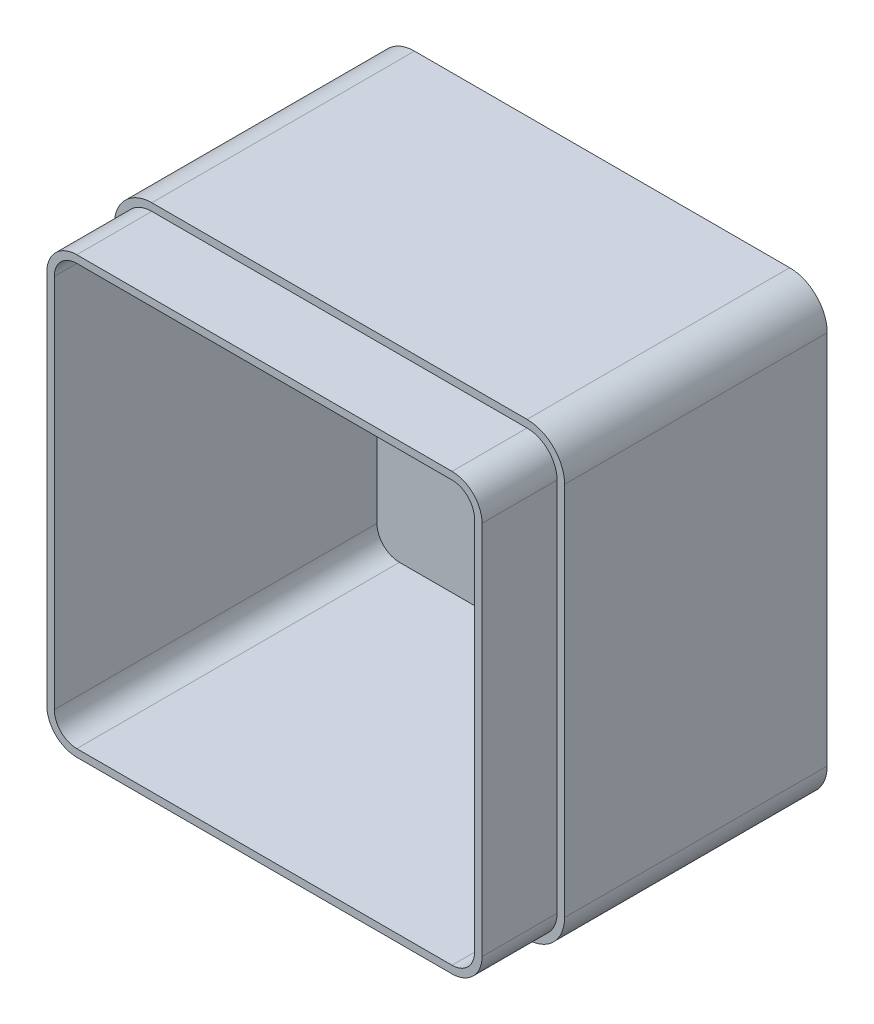
ISO-10303-21;
HEADER;
FILE_DESCRIPTION(('STEP AP214'),'2;1');
FILE_NAME('part.step','',(''),(''),'','','');
FILE_SCHEMA(('AUTOMOTIVE_DESIGN { 1 0 10303 214 1 1 1 1 }'));
ENDSEC;
DATA;
#1=APPLICATION_CONTEXT('core data for automotive mechanical design processes');
#2=APPLICATION_PROTOCOL_DEFINITION('international standard','automotive_design',2000,#1);
#3=PRODUCT_CONTEXT('',#1,'mechanical');
#4=PRODUCT('Part','Part','',(#3));
#5=PRODUCT_RELATED_PRODUCT_CATEGORY('part','',(#4));
#6=PRODUCT_DEFINITION_FORMATION('','',#4);
#7=PRODUCT_DEFINITION_CONTEXT('part definition',#1,'design');
#8=PRODUCT_DEFINITION('design','',#6,#7);
#9=PRODUCT_DEFINITION_SHAPE('','',#8);
#10=(LENGTH_UNIT() NAMED_UNIT(*) SI_UNIT(.MILLI.,.METRE.));
#11=(NAMED_UNIT(*) PLANE_ANGLE_UNIT() SI_UNIT($,.RADIAN.));
#12=(NAMED_UNIT(*) SI_UNIT($,.STERADIAN.) SOLID_ANGLE_UNIT());
#13=UNCERTAINTY_MEASURE_WITH_UNIT(LENGTH_MEASURE(1.E-05),#10,'distance_accuracy_value','');
#14=(GEOMETRIC_REPRESENTATION_CONTEXT(3) GLOBAL_UNCERTAINTY_ASSIGNED_CONTEXT((#13)) GLOBAL_UNIT_ASSIGNED_CONTEXT((#10,
#11,#12)) REPRESENTATION_CONTEXT('',''));
#15=CARTESIAN_POINT('',(0.,0.,0.));
#16=DIRECTION('',(0.,0.,1.));
#17=DIRECTION('',(1.,0.,0.));
#18=AXIS2_PLACEMENT_3D('',#15,#16,#17);
#19=CARTESIAN_POINT('',(0.,0.,90.));
#20=DIRECTION('',(0.,0.,-1.));
#21=DIRECTION('',(-1.,0.,0.));
#22=AXIS2_PLACEMENT_3D('',#19,#20,#21);
#23=PLANE('',#22);
#24=DIRECTION('',(0.,-1.,0.));
#25=VECTOR('',#24,1.);
#26=CARTESIAN_POINT('',(4.,0.,90.));
#27=LINE('',#26,#25);
#28=CARTESIAN_POINT('',(3.99999999999997,110.,90.));
#29=VERTEX_POINT('',#28);
#30=CARTESIAN_POINT('',(4.,10.,90.));
#31=VERTEX_POINT('',#30);
#32=EDGE_CURVE('E347',#29,#31,#27,.T.);
#33=ORIENTED_EDGE('',*,*,#32,.F.);
#34=CARTESIAN_POINT('',(9.99999999999997,110.,90.));
#35=DIRECTION('',(0.,0.,-1.));
#36=DIRECTION('',(-1.,0.,0.));
#37=AXIS2_PLACEMENT_3D('',#34,#35,#36);
#38=CIRCLE('',#37,6.);
#39=CARTESIAN_POINT('',(9.99999999999997,116.,90.));
#40=VERTEX_POINT('',#39);
#41=EDGE_CURVE('E387',#40,#29,#38,.F.);
#42=ORIENTED_EDGE('',*,*,#41,.F.);
#43=DIRECTION('',(-1.,0.,0.));
#44=VECTOR('',#43,1.);
#45=CARTESIAN_POINT('',(0.,116.,90.));
#46=LINE('',#45,#44);
#47=CARTESIAN_POINT('',(110.,116.,90.));
#48=VERTEX_POINT('',#47);
#49=EDGE_CURVE('E363',#48,#40,#46,.T.);
#50=ORIENTED_EDGE('',*,*,#49,.F.);
#51=CARTESIAN_POINT('',(110.,110.,90.));
#52=DIRECTION('',(0.,0.,-1.));
#53=DIRECTION('',(-1.,0.,0.));
#54=AXIS2_PLACEMENT_3D('',#51,#52,#53);
#55=CIRCLE('',#54,6.);
#56=CARTESIAN_POINT('',(116.,110.,90.));
#57=VERTEX_POINT('',#56);
#58=EDGE_CURVE('E327',#57,#48,#55,.F.);
#59=ORIENTED_EDGE('',*,*,#58,.F.);
#60=DIRECTION('',(0.,1.,0.));
#61=VECTOR('',#60,1.);
#62=CARTESIAN_POINT('',(116.,0.,90.));
#63=LINE('',#62,#61);
#64=CARTESIAN_POINT('',(116.,10.,90.));
#65=VERTEX_POINT('',#64);
#66=EDGE_CURVE('E391',#65,#57,#63,.T.);
#67=ORIENTED_EDGE('',*,*,#66,.F.);
#68=CARTESIAN_POINT('',(110.,10.,90.));
#69=DIRECTION('',(0.,0.,-1.));
#70=DIRECTION('',(-1.,0.,0.));
#71=AXIS2_PLACEMENT_3D('',#68,#69,#70);
#72=CIRCLE('',#71,6.);
#73=CARTESIAN_POINT('',(110.,4.,90.));
#74=VERTEX_POINT('',#73);
#75=EDGE_CURVE('E392',#74,#65,#72,.F.);
#76=ORIENTED_EDGE('',*,*,#75,.F.);
#77=DIRECTION('',(1.,0.,0.));
#78=VECTOR('',#77,1.);
#79=CARTESIAN_POINT('',(0.,4.,90.));
#80=LINE('',#79,#78);
#81=CARTESIAN_POINT('',(9.99999999999999,4.,90.));
#82=VERTEX_POINT('',#81);
#83=EDGE_CURVE('E384',#82,#74,#80,.T.);
#84=ORIENTED_EDGE('',*,*,#83,.F.);
#85=CARTESIAN_POINT('',(9.99999999999999,10.,90.));
#86=DIRECTION('',(0.,0.,-1.));
#87=DIRECTION('',(-1.,0.,0.));
#88=AXIS2_PLACEMENT_3D('',#85,#86,#87);
#89=CIRCLE('',#88,6.);
#90=EDGE_CURVE('E377',#31,#82,#89,.F.);
#91=ORIENTED_EDGE('',*,*,#90,.F.);
#92=EDGE_LOOP('',(#33,#42,#50,#59,#67,#76,#84,#91));
#93=FACE_BOUND('',#92,.T.);
#94=CARTESIAN_POINT('',(9.99999999999997,110.,90.));
#95=DIRECTION('',(0.,0.,1.));
#96=DIRECTION('',(1.,0.,0.));
#97=AXIS2_PLACEMENT_3D('',#94,#95,#96);
#98=CIRCLE('',#97,8.);
#99=CARTESIAN_POINT('',(9.99999999999997,118.,90.));
#100=VERTEX_POINT('',#99);
#101=CARTESIAN_POINT('',(1.99999999999997,110.,90.));
#102=VERTEX_POINT('',#101);
#103=EDGE_CURVE('E255',#100,#102,#98,.T.);
#104=ORIENTED_EDGE('',*,*,#103,.T.);
#105=DIRECTION('',(0.,-1.,0.));
#106=VECTOR('',#105,1.);
#107=CARTESIAN_POINT('',(1.99999999999997,110.,90.));
#108=LINE('',#107,#106);
#109=CARTESIAN_POINT('',(1.99999999999997,9.99999999999999,90.));
#110=VERTEX_POINT('',#109);
#111=EDGE_CURVE('E205',#102,#110,#108,.T.);
#112=ORIENTED_EDGE('',*,*,#111,.T.);
#113=CARTESIAN_POINT('',(9.99999999999999,10.,90.));
#114=DIRECTION('',(0.,0.,1.));
#115=DIRECTION('',(1.,0.,0.));
#116=AXIS2_PLACEMENT_3D('',#113,#114,#115);
#117=CIRCLE('',#116,8.00000000000001);
#118=CARTESIAN_POINT('',(9.99999999999999,1.99999999999999,90.));
#119=VERTEX_POINT('',#118);
#120=EDGE_CURVE('E54',#110,#119,#117,.T.);
#121=ORIENTED_EDGE('',*,*,#120,.T.);
#122=DIRECTION('',(1.,0.,0.));
#123=VECTOR('',#122,1.);
#124=CARTESIAN_POINT('',(9.99999999999999,2.,90.));
#125=LINE('',#124,#123);
#126=CARTESIAN_POINT('',(110.,2.,90.));
#127=VERTEX_POINT('',#126);
#128=EDGE_CURVE('E262',#119,#127,#125,.T.);
#129=ORIENTED_EDGE('',*,*,#128,.T.);
#130=CARTESIAN_POINT('',(110.,10.,90.));
#131=DIRECTION('',(0.,0.,1.));
#132=DIRECTION('',(1.,0.,0.));
#133=AXIS2_PLACEMENT_3D('',#130,#131,#132);
#134=CIRCLE('',#133,7.99999999999999);
#135=CARTESIAN_POINT('',(118.,10.,90.));
#136=VERTEX_POINT('',#135);
#137=EDGE_CURVE('E266',#127,#136,#134,.T.);
#138=ORIENTED_EDGE('',*,*,#137,.T.);
#139=DIRECTION('',(0.,1.,0.));
#140=VECTOR('',#139,1.);
#141=CARTESIAN_POINT('',(118.,9.99999999999999,90.));
#142=LINE('',#141,#140);
#143=CARTESIAN_POINT('',(118.,110.,90.));
#144=VERTEX_POINT('',#143);
#145=EDGE_CURVE('E270',#136,#144,#142,.T.);
#146=ORIENTED_EDGE('',*,*,#145,.T.);
#147=CARTESIAN_POINT('',(110.,110.,90.));
#148=DIRECTION('',(0.,0.,1.));
#149=DIRECTION('',(1.,0.,0.));
#150=AXIS2_PLACEMENT_3D('',#147,#148,#149);
#151=CIRCLE('',#150,8.00000000000001);
#152=CARTESIAN_POINT('',(110.,118.,90.));
#153=VERTEX_POINT('',#152);
#154=EDGE_CURVE('E232',#144,#153,#151,.T.);
#155=ORIENTED_EDGE('',*,*,#154,.T.);
#156=DIRECTION('',(-1.,0.,0.));
#157=VECTOR('',#156,1.);
#158=CARTESIAN_POINT('',(110.,118.,90.));
#159=LINE('',#158,#157);
#160=EDGE_CURVE('E228',#153,#100,#159,.T.);
#161=ORIENTED_EDGE('',*,*,#160,.T.);
#162=EDGE_LOOP('',(#104,#112,#121,#129,#138,#146,#155,#161));
#163=FACE_BOUND('',#162,.T.);
#164=ADVANCED_FACE('F38',(#93,#163),#23,.F.);
#165=CARTESIAN_POINT('',(4.,0.,90.));
#166=DIRECTION('',(1.,0.,0.));
#167=DIRECTION('',(0.,1.,0.));
#168=AXIS2_PLACEMENT_3D('',#165,#166,#167);
#169=PLANE('',#168);
#170=DIRECTION('',(0.,-1.,0.));
#171=VECTOR('',#170,1.);
#172=CARTESIAN_POINT('',(4.,0.,4.));
#173=LINE('',#172,#171);
#174=CARTESIAN_POINT('',(3.99999999999997,110.,4.));
#175=VERTEX_POINT('',#174);
#176=CARTESIAN_POINT('',(4.,10.,4.));
#177=VERTEX_POINT('',#176);
#178=EDGE_CURVE('E319',#175,#177,#173,.T.);
#179=ORIENTED_EDGE('',*,*,#178,.F.);
#180=DIRECTION('',(0.,0.,1.));
#181=VECTOR('',#180,1.);
#182=CARTESIAN_POINT('',(3.99999999999997,110.,90.));
#183=LINE('',#182,#181);
#184=EDGE_CURVE('E328',#29,#175,#183,.F.);
#185=ORIENTED_EDGE('',*,*,#184,.F.);
#186=ORIENTED_EDGE('',*,*,#32,.T.);
#187=DIRECTION('',(0.,0.,1.));
#188=VECTOR('',#187,1.);
#189=CARTESIAN_POINT('',(4.,10.,90.));
#190=LINE('',#189,#188);
#191=EDGE_CURVE('E324',#177,#31,#190,.T.);
#192=ORIENTED_EDGE('',*,*,#191,.F.);
#193=EDGE_LOOP('',(#179,#185,#186,#192));
#194=FACE_BOUND('',#193,.T.);
#195=ADVANCED_FACE('F505',(#194),#169,.T.);
#196=CARTESIAN_POINT('',(0.,4.,90.));
#197=DIRECTION('',(0.,1.,0.));
#198=DIRECTION('',(0.,0.,1.));
#199=AXIS2_PLACEMENT_3D('',#196,#197,#198);
#200=PLANE('',#199);
#201=ORIENTED_EDGE('',*,*,#83,.T.);
#202=DIRECTION('',(0.,0.,1.));
#203=VECTOR('',#202,1.);
#204=CARTESIAN_POINT('',(110.,4.,90.));
#205=LINE('',#204,#203);
#206=CARTESIAN_POINT('',(110.,4.,4.));
#207=VERTEX_POINT('',#206);
#208=EDGE_CURVE('E360',#207,#74,#205,.T.);
#209=ORIENTED_EDGE('',*,*,#208,.F.);
#210=DIRECTION('',(1.,0.,0.));
#211=VECTOR('',#210,1.);
#212=CARTESIAN_POINT('',(0.,4.,4.));
#213=LINE('',#212,#211);
#214=CARTESIAN_POINT('',(9.99999999999999,4.,4.));
#215=VERTEX_POINT('',#214);
#216=EDGE_CURVE('E323',#215,#207,#213,.T.);
#217=ORIENTED_EDGE('',*,*,#216,.F.);
#218=DIRECTION('',(0.,0.,1.));
#219=VECTOR('',#218,1.);
#220=CARTESIAN_POINT('',(9.99999999999999,4.,90.));
#221=LINE('',#220,#219);
#222=EDGE_CURVE('E351',#82,#215,#221,.F.);
#223=ORIENTED_EDGE('',*,*,#222,.F.);
#224=EDGE_LOOP('',(#201,#209,#217,#223));
#225=FACE_BOUND('',#224,.T.);
#226=ADVANCED_FACE('F511',(#225),#200,.T.);
#227=CARTESIAN_POINT('',(116.,0.,90.));
#228=DIRECTION('',(-1.,0.,0.));
#229=DIRECTION('',(0.,-1.,0.));
#230=AXIS2_PLACEMENT_3D('',#227,#228,#229);
#231=PLANE('',#230);
#232=ORIENTED_EDGE('',*,*,#66,.T.);
#233=DIRECTION('',(0.,0.,1.));
#234=VECTOR('',#233,1.);
#235=CARTESIAN_POINT('',(116.,110.,90.));
#236=LINE('',#235,#234);
#237=CARTESIAN_POINT('',(116.,110.,4.));
#238=VERTEX_POINT('',#237);
#239=EDGE_CURVE('E369',#238,#57,#236,.T.);
#240=ORIENTED_EDGE('',*,*,#239,.F.);
#241=DIRECTION('',(0.,1.,0.));
#242=VECTOR('',#241,1.);
#243=CARTESIAN_POINT('',(116.,0.,4.));
#244=LINE('',#243,#242);
#245=CARTESIAN_POINT('',(116.,10.,4.));
#246=VERTEX_POINT('',#245);
#247=EDGE_CURVE('E336',#246,#238,#244,.T.);
#248=ORIENTED_EDGE('',*,*,#247,.F.);
#249=DIRECTION('',(0.,0.,1.));
#250=VECTOR('',#249,1.);
#251=CARTESIAN_POINT('',(116.,10.,90.));
#252=LINE('',#251,#250);
#253=EDGE_CURVE('E364',#65,#246,#252,.F.);
#254=ORIENTED_EDGE('',*,*,#253,.F.);
#255=EDGE_LOOP('',(#232,#240,#248,#254));
#256=FACE_BOUND('',#255,.T.);
#257=ADVANCED_FACE('F540',(#256),#231,.T.);
#258=CARTESIAN_POINT('',(0.,116.,90.));
#259=DIRECTION('',(0.,-1.,0.));
#260=DIRECTION('',(0.,0.,-1.));
#261=AXIS2_PLACEMENT_3D('',#258,#259,#260);
#262=PLANE('',#261);
#263=DIRECTION('',(-1.,0.,0.));
#264=VECTOR('',#263,1.);
#265=CARTESIAN_POINT('',(0.,116.,4.));
#266=LINE('',#265,#264);
#267=CARTESIAN_POINT('',(110.,116.,4.));
#268=VERTEX_POINT('',#267);
#269=CARTESIAN_POINT('',(9.99999999999997,116.,4.));
#270=VERTEX_POINT('',#269);
#271=EDGE_CURVE('E343',#268,#270,#266,.T.);
#272=ORIENTED_EDGE('',*,*,#271,.F.);
#273=DIRECTION('',(0.,0.,-1.));
#274=VECTOR('',#273,1.);
#275=CARTESIAN_POINT('',(110.,116.,90.));
#276=LINE('',#275,#274);
#277=EDGE_CURVE('E373',#48,#268,#276,.T.);
#278=ORIENTED_EDGE('',*,*,#277,.F.);
#279=ORIENTED_EDGE('',*,*,#49,.T.);
#280=DIRECTION('',(0.,0.,-1.));
#281=VECTOR('',#280,1.);
#282=CARTESIAN_POINT('',(9.99999999999997,116.,90.));
#283=LINE('',#282,#281);
#284=EDGE_CURVE('E372',#270,#40,#283,.F.);
#285=ORIENTED_EDGE('',*,*,#284,.F.);
#286=EDGE_LOOP('',(#272,#278,#279,#285));
#287=FACE_BOUND('',#286,.T.);
#288=ADVANCED_FACE('F536',(#287),#262,.T.);
#289=CARTESIAN_POINT('',(0.,0.,4.));
#290=DIRECTION('',(0.,0.,-1.));
#291=DIRECTION('',(-1.,0.,0.));
#292=AXIS2_PLACEMENT_3D('',#289,#290,#291);
#293=PLANE('',#292);
#294=ORIENTED_EDGE('',*,*,#216,.T.);
#295=CARTESIAN_POINT('',(110.,10.,4.));
#296=DIRECTION('',(0.,0.,-1.));
#297=DIRECTION('',(-1.,0.,0.));
#298=AXIS2_PLACEMENT_3D('',#295,#296,#297);
#299=CIRCLE('',#298,6.);
#300=EDGE_CURVE('E342',#246,#207,#299,.T.);
#301=ORIENTED_EDGE('',*,*,#300,.F.);
#302=ORIENTED_EDGE('',*,*,#247,.T.);
#303=CARTESIAN_POINT('',(110.,110.,4.));
#304=DIRECTION('',(0.,0.,-1.));
#305=DIRECTION('',(-1.,0.,0.));
#306=AXIS2_PLACEMENT_3D('',#303,#304,#305);
#307=CIRCLE('',#306,6.);
#308=EDGE_CURVE('E348',#268,#238,#307,.T.);
#309=ORIENTED_EDGE('',*,*,#308,.F.);
#310=ORIENTED_EDGE('',*,*,#271,.T.);
#311=CARTESIAN_POINT('',(9.99999999999997,110.,4.));
#312=DIRECTION('',(0.,0.,-1.));
#313=DIRECTION('',(-1.,0.,0.));
#314=AXIS2_PLACEMENT_3D('',#311,#312,#313);
#315=CIRCLE('',#314,6.);
#316=EDGE_CURVE('E339',#175,#270,#315,.T.);
#317=ORIENTED_EDGE('',*,*,#316,.F.);
#318=ORIENTED_EDGE('',*,*,#178,.T.);
#319=CARTESIAN_POINT('',(9.99999999999999,10.,4.));
#320=DIRECTION('',(0.,0.,-1.));
#321=DIRECTION('',(-1.,0.,0.));
#322=AXIS2_PLACEMENT_3D('',#319,#320,#321);
#323=CIRCLE('',#322,6.);
#324=EDGE_CURVE('E332',#215,#177,#323,.T.);
#325=ORIENTED_EDGE('',*,*,#324,.F.);
#326=EDGE_LOOP('',(#294,#301,#302,#309,#310,#317,#318,#325));
#327=FACE_BOUND('',#326,.T.);
#328=ADVANCED_FACE('F532',(#327),#293,.F.);
#329=CARTESIAN_POINT('',(9.99999999999999,10.,90.));
#330=DIRECTION('',(0.,0.,-1.));
#331=DIRECTION('',(-1.,0.,0.));
#332=AXIS2_PLACEMENT_3D('',#329,#330,#331);
#333=CYLINDRICAL_SURFACE('',#332,6.);
#334=ORIENTED_EDGE('',*,*,#90,.T.);
#335=ORIENTED_EDGE('',*,*,#222,.T.);
#336=ORIENTED_EDGE('',*,*,#324,.T.);
#337=ORIENTED_EDGE('',*,*,#191,.T.);
#338=EDGE_LOOP('',(#334,#335,#336,#337));
#339=FACE_BOUND('',#338,.T.);
#340=ADVANCED_FACE('F528',(#339),#333,.F.);
#341=CARTESIAN_POINT('',(9.99999999999997,110.,90.));
#342=DIRECTION('',(0.,0.,-1.));
#343=DIRECTION('',(-1.,0.,0.));
#344=AXIS2_PLACEMENT_3D('',#341,#342,#343);
#345=CYLINDRICAL_SURFACE('',#344,6.);
#346=ORIENTED_EDGE('',*,*,#41,.T.);
#347=ORIENTED_EDGE('',*,*,#184,.T.);
#348=ORIENTED_EDGE('',*,*,#316,.T.);
#349=ORIENTED_EDGE('',*,*,#284,.T.);
#350=EDGE_LOOP('',(#346,#347,#348,#349));
#351=FACE_BOUND('',#350,.T.);
#352=ADVANCED_FACE('F524',(#351),#345,.F.);
#353=CARTESIAN_POINT('',(110.,10.,90.));
#354=DIRECTION('',(0.,0.,-1.));
#355=DIRECTION('',(-1.,0.,0.));
#356=AXIS2_PLACEMENT_3D('',#353,#354,#355);
#357=CYLINDRICAL_SURFACE('',#356,6.);
#358=ORIENTED_EDGE('',*,*,#75,.T.);
#359=ORIENTED_EDGE('',*,*,#253,.T.);
#360=ORIENTED_EDGE('',*,*,#300,.T.);
#361=ORIENTED_EDGE('',*,*,#208,.T.);
#362=EDGE_LOOP('',(#358,#359,#360,#361));
#363=FACE_BOUND('',#362,.T.);
#364=ADVANCED_FACE('F520',(#363),#357,.F.);
#365=CARTESIAN_POINT('',(110.,110.,90.));
#366=DIRECTION('',(0.,0.,-1.));
#367=DIRECTION('',(-1.,0.,0.));
#368=AXIS2_PLACEMENT_3D('',#365,#366,#367);
#369=CYLINDRICAL_SURFACE('',#368,6.);
#370=ORIENTED_EDGE('',*,*,#58,.T.);
#371=ORIENTED_EDGE('',*,*,#277,.T.);
#372=ORIENTED_EDGE('',*,*,#308,.T.);
#373=ORIENTED_EDGE('',*,*,#239,.T.);
#374=EDGE_LOOP('',(#370,#371,#372,#373));
#375=FACE_BOUND('',#374,.T.);
#376=ADVANCED_FACE('F517',(#375),#369,.F.);
#377=CARTESIAN_POINT('',(9.99999999999997,110.,70.));
#378=DIRECTION('',(0.,0.,1.));
#379=DIRECTION('',(1.,0.,0.));
#380=AXIS2_PLACEMENT_3D('',#377,#378,#379);
#381=PLANE('',#380);
#382=DIRECTION('',(-1.,0.,0.));
#383=VECTOR('',#382,1.);
#384=CARTESIAN_POINT('',(110.,118.,70.));
#385=LINE('',#384,#383);
#386=CARTESIAN_POINT('',(110.,118.,70.));
#387=VERTEX_POINT('',#386);
#388=CARTESIAN_POINT('',(9.99999999999997,118.,70.));
#389=VERTEX_POINT('',#388);
#390=EDGE_CURVE('E212',#387,#389,#385,.T.);
#391=ORIENTED_EDGE('',*,*,#390,.F.);
#392=CARTESIAN_POINT('',(110.,110.,70.));
#393=DIRECTION('',(0.,0.,1.));
#394=DIRECTION('',(1.,0.,0.));
#395=AXIS2_PLACEMENT_3D('',#392,#393,#394);
#396=CIRCLE('',#395,8.00000000000001);
#397=CARTESIAN_POINT('',(118.,110.,70.));
#398=VERTEX_POINT('',#397);
#399=EDGE_CURVE('E249',#398,#387,#396,.T.);
#400=ORIENTED_EDGE('',*,*,#399,.F.);
#401=DIRECTION('',(0.,1.,0.));
#402=VECTOR('',#401,1.);
#403=CARTESIAN_POINT('',(118.,9.99999999999999,70.));
#404=LINE('',#403,#402);
#405=CARTESIAN_POINT('',(118.,10.,70.));
#406=VERTEX_POINT('',#405);
#407=EDGE_CURVE('E245',#406,#398,#404,.T.);
#408=ORIENTED_EDGE('',*,*,#407,.F.);
#409=CARTESIAN_POINT('',(110.,10.,70.));
#410=DIRECTION('',(0.,0.,1.));
#411=DIRECTION('',(1.,0.,0.));
#412=AXIS2_PLACEMENT_3D('',#409,#410,#411);
#413=CIRCLE('',#412,7.99999999999999);
#414=CARTESIAN_POINT('',(110.,2.,70.));
#415=VERTEX_POINT('',#414);
#416=EDGE_CURVE('E241',#415,#406,#413,.T.);
#417=ORIENTED_EDGE('',*,*,#416,.F.);
#418=DIRECTION('',(1.,0.,0.));
#419=VECTOR('',#418,1.);
#420=CARTESIAN_POINT('',(9.99999999999999,2.,70.));
#421=LINE('',#420,#419);
#422=CARTESIAN_POINT('',(9.99999999999999,1.99999999999999,70.));
#423=VERTEX_POINT('',#422);
#424=EDGE_CURVE('E237',#423,#415,#421,.T.);
#425=ORIENTED_EDGE('',*,*,#424,.F.);
#426=CARTESIAN_POINT('',(9.99999999999999,10.,70.));
#427=DIRECTION('',(0.,0.,1.));
#428=DIRECTION('',(1.,0.,0.));
#429=AXIS2_PLACEMENT_3D('',#426,#427,#428);
#430=CIRCLE('',#429,8.00000000000001);
#431=CARTESIAN_POINT('',(1.99999999999997,9.99999999999999,70.));
#432=VERTEX_POINT('',#431);
#433=EDGE_CURVE('E222',#432,#423,#430,.T.);
#434=ORIENTED_EDGE('',*,*,#433,.F.);
#435=DIRECTION('',(0.,-1.,0.));
#436=VECTOR('',#435,1.);
#437=CARTESIAN_POINT('',(1.99999999999997,110.,70.));
#438=LINE('',#437,#436);
#439=CARTESIAN_POINT('',(1.99999999999997,110.,70.));
#440=VERTEX_POINT('',#439);
#441=EDGE_CURVE('E203',#440,#432,#438,.T.);
#442=ORIENTED_EDGE('',*,*,#441,.F.);
#443=CARTESIAN_POINT('',(9.99999999999997,110.,70.));
#444=DIRECTION('',(0.,0.,1.));
#445=DIRECTION('',(1.,0.,0.));
#446=AXIS2_PLACEMENT_3D('',#443,#444,#445);
#447=CIRCLE('',#446,8.);
#448=EDGE_CURVE('E218',#389,#440,#447,.T.);
#449=ORIENTED_EDGE('',*,*,#448,.F.);
#450=EDGE_LOOP('',(#391,#400,#408,#417,#425,#434,#442,#449));
#451=FACE_BOUND('',#450,.T.);
#452=CARTESIAN_POINT('',(9.99999999999997,110.,70.));
#453=DIRECTION('',(0.,0.,1.));
#454=DIRECTION('',(1.,0.,0.));
#455=AXIS2_PLACEMENT_3D('',#452,#453,#454);
#456=CIRCLE('',#455,10.);
#457=CARTESIAN_POINT('',(9.99999999999997,120.,70.));
#458=VERTEX_POINT('',#457);
#459=CARTESIAN_POINT('',(0.,110.,70.));
#460=VERTEX_POINT('',#459);
#461=EDGE_CURVE('E279',#458,#460,#456,.T.);
#462=ORIENTED_EDGE('',*,*,#461,.T.);
#463=DIRECTION('',(0.,-1.,0.));
#464=VECTOR('',#463,1.);
#465=CARTESIAN_POINT('',(0.,110.,70.));
#466=LINE('',#465,#464);
#467=CARTESIAN_POINT('',(0.,10.,70.));
#468=VERTEX_POINT('',#467);
#469=EDGE_CURVE('E299',#460,#468,#466,.T.);
#470=ORIENTED_EDGE('',*,*,#469,.T.);
#471=CARTESIAN_POINT('',(9.99999999999999,10.,70.));
#472=DIRECTION('',(0.,0.,1.));
#473=DIRECTION('',(1.,0.,0.));
#474=AXIS2_PLACEMENT_3D('',#471,#472,#473);
#475=CIRCLE('',#474,10.);
#476=CARTESIAN_POINT('',(9.99999999999999,0.,70.));
#477=VERTEX_POINT('',#476);
#478=EDGE_CURVE('E302',#468,#477,#475,.T.);
#479=ORIENTED_EDGE('',*,*,#478,.T.);
#480=DIRECTION('',(1.,0.,0.));
#481=VECTOR('',#480,1.);
#482=CARTESIAN_POINT('',(9.99999999999999,0.,70.));
#483=LINE('',#482,#481);
#484=CARTESIAN_POINT('',(110.,0.,70.));
#485=VERTEX_POINT('',#484);
#486=EDGE_CURVE('E305',#477,#485,#483,.T.);
#487=ORIENTED_EDGE('',*,*,#486,.T.);
#488=CARTESIAN_POINT('',(110.,10.,70.));
#489=DIRECTION('',(0.,0.,1.));
#490=DIRECTION('',(1.,0.,0.));
#491=AXIS2_PLACEMENT_3D('',#488,#489,#490);
#492=CIRCLE('',#491,9.99999999999999);
#493=CARTESIAN_POINT('',(120.,10.,70.));
#494=VERTEX_POINT('',#493);
#495=EDGE_CURVE('E308',#485,#494,#492,.T.);
#496=ORIENTED_EDGE('',*,*,#495,.T.);
#497=DIRECTION('',(0.,1.,0.));
#498=VECTOR('',#497,1.);
#499=CARTESIAN_POINT('',(120.,10.,70.));
#500=LINE('',#499,#498);
#501=CARTESIAN_POINT('',(120.,110.,70.));
#502=VERTEX_POINT('',#501);
#503=EDGE_CURVE('E62',#494,#502,#500,.T.);
#504=ORIENTED_EDGE('',*,*,#503,.T.);
#505=CARTESIAN_POINT('',(110.,110.,70.));
#506=DIRECTION('',(0.,0.,1.));
#507=DIRECTION('',(1.,0.,0.));
#508=AXIS2_PLACEMENT_3D('',#505,#506,#507);
#509=CIRCLE('',#508,9.99999999999999);
#510=CARTESIAN_POINT('',(110.,120.,70.));
#511=VERTEX_POINT('',#510);
#512=EDGE_CURVE('E313',#502,#511,#509,.T.);
#513=ORIENTED_EDGE('',*,*,#512,.T.);
#514=DIRECTION('',(-1.,0.,0.));
#515=VECTOR('',#514,1.);
#516=CARTESIAN_POINT('',(110.,120.,70.));
#517=LINE('',#516,#515);
#518=EDGE_CURVE('E316',#511,#458,#517,.T.);
#519=ORIENTED_EDGE('',*,*,#518,.T.);
#520=EDGE_LOOP('',(#462,#470,#479,#487,#496,#504,#513,#519));
#521=FACE_BOUND('',#520,.T.);
#522=ADVANCED_FACE('F217',(#451,#521),#381,.T.);
#523=CARTESIAN_POINT('',(9.99999999999997,110.,70.));
#524=DIRECTION('',(0.,0.,1.));
#525=DIRECTION('',(1.,0.,0.));
#526=AXIS2_PLACEMENT_3D('',#523,#524,#525);
#527=CYLINDRICAL_SURFACE('',#526,8.);
#528=ORIENTED_EDGE('',*,*,#103,.F.);
#529=DIRECTION('',(0.,0.,1.));
#530=VECTOR('',#529,1.);
#531=CARTESIAN_POINT('',(9.99999999999997,118.,70.));
#532=LINE('',#531,#530);
#533=EDGE_CURVE('E226',#389,#100,#532,.T.);
#534=ORIENTED_EDGE('',*,*,#533,.F.);
#535=ORIENTED_EDGE('',*,*,#448,.T.);
#536=DIRECTION('',(0.,0.,1.));
#537=VECTOR('',#536,1.);
#538=CARTESIAN_POINT('',(1.99999999999997,110.,70.));
#539=LINE('',#538,#537);
#540=EDGE_CURVE('E200',#440,#102,#539,.T.);
#541=ORIENTED_EDGE('',*,*,#540,.T.);
#542=EDGE_LOOP('',(#528,#534,#535,#541));
#543=FACE_BOUND('',#542,.T.);
#544=ADVANCED_FACE('F225',(#543),#527,.T.);
#545=CARTESIAN_POINT('',(110.,118.,70.));
#546=DIRECTION('',(0.,1.,0.));
#547=DIRECTION('',(0.,0.,1.));
#548=AXIS2_PLACEMENT_3D('',#545,#546,#547);
#549=PLANE('',#548);
#550=ORIENTED_EDGE('',*,*,#160,.F.);
#551=DIRECTION('',(0.,0.,1.));
#552=VECTOR('',#551,1.);
#553=CARTESIAN_POINT('',(110.,118.,70.));
#554=LINE('',#553,#552);
#555=EDGE_CURVE('E280',#387,#153,#554,.T.);
#556=ORIENTED_EDGE('',*,*,#555,.F.);
#557=ORIENTED_EDGE('',*,*,#390,.T.);
#558=ORIENTED_EDGE('',*,*,#533,.T.);
#559=EDGE_LOOP('',(#550,#556,#557,#558));
#560=FACE_BOUND('',#559,.T.);
#561=ADVANCED_FACE('F551',(#560),#549,.T.);
#562=CARTESIAN_POINT('',(110.,110.,70.));
#563=DIRECTION('',(0.,0.,1.));
#564=DIRECTION('',(1.,0.,0.));
#565=AXIS2_PLACEMENT_3D('',#562,#563,#564);
#566=CYLINDRICAL_SURFACE('',#565,8.00000000000001);
#567=ORIENTED_EDGE('',*,*,#154,.F.);
#568=DIRECTION('',(0.,0.,1.));
#569=VECTOR('',#568,1.);
#570=CARTESIAN_POINT('',(118.,110.,70.));
#571=LINE('',#570,#569);
#572=EDGE_CURVE('E283',#398,#144,#571,.T.);
#573=ORIENTED_EDGE('',*,*,#572,.F.);
#574=ORIENTED_EDGE('',*,*,#399,.T.);
#575=ORIENTED_EDGE('',*,*,#555,.T.);
#576=EDGE_LOOP('',(#567,#573,#574,#575));
#577=FACE_BOUND('',#576,.T.);
#578=ADVANCED_FACE('F566',(#577),#566,.T.);
#579=CARTESIAN_POINT('',(118.,9.99999999999999,70.));
#580=DIRECTION('',(1.,0.,0.));
#581=DIRECTION('',(0.,0.,-1.));
#582=AXIS2_PLACEMENT_3D('',#579,#580,#581);
#583=PLANE('',#582);
#584=ORIENTED_EDGE('',*,*,#145,.F.);
#585=DIRECTION('',(0.,0.,1.));
#586=VECTOR('',#585,1.);
#587=CARTESIAN_POINT('',(118.,10.,70.));
#588=LINE('',#587,#586);
#589=EDGE_CURVE('E286',#406,#136,#588,.T.);
#590=ORIENTED_EDGE('',*,*,#589,.F.);
#591=ORIENTED_EDGE('',*,*,#407,.T.);
#592=ORIENTED_EDGE('',*,*,#572,.T.);
#593=EDGE_LOOP('',(#584,#590,#591,#592));
#594=FACE_BOUND('',#593,.T.);
#595=ADVANCED_FACE('F562',(#594),#583,.T.);
#596=CARTESIAN_POINT('',(110.,10.,70.));
#597=DIRECTION('',(0.,0.,1.));
#598=DIRECTION('',(1.,0.,0.));
#599=AXIS2_PLACEMENT_3D('',#596,#597,#598);
#600=CYLINDRICAL_SURFACE('',#599,7.99999999999999);
#601=ORIENTED_EDGE('',*,*,#137,.F.);
#602=DIRECTION('',(0.,0.,1.));
#603=VECTOR('',#602,1.);
#604=CARTESIAN_POINT('',(110.,2.,70.));
#605=LINE('',#604,#603);
#606=EDGE_CURVE('E289',#415,#127,#605,.T.);
#607=ORIENTED_EDGE('',*,*,#606,.F.);
#608=ORIENTED_EDGE('',*,*,#416,.T.);
#609=ORIENTED_EDGE('',*,*,#589,.T.);
#610=EDGE_LOOP('',(#601,#607,#608,#609));
#611=FACE_BOUND('',#610,.T.);
#612=ADVANCED_FACE('F558',(#611),#600,.T.);
#613=CARTESIAN_POINT('',(9.99999999999999,2.,70.));
#614=DIRECTION('',(0.,-1.,0.));
#615=DIRECTION('',(0.,0.,-1.));
#616=AXIS2_PLACEMENT_3D('',#613,#614,#615);
#617=PLANE('',#616);
#618=ORIENTED_EDGE('',*,*,#128,.F.);
#619=DIRECTION('',(0.,0.,1.));
#620=VECTOR('',#619,1.);
#621=CARTESIAN_POINT('',(9.99999999999999,1.99999999999999,70.));
#622=LINE('',#621,#620);
#623=EDGE_CURVE('E292',#423,#119,#622,.T.);
#624=ORIENTED_EDGE('',*,*,#623,.F.);
#625=ORIENTED_EDGE('',*,*,#424,.T.);
#626=ORIENTED_EDGE('',*,*,#606,.T.);
#627=EDGE_LOOP('',(#618,#624,#625,#626));
#628=FACE_BOUND('',#627,.T.);
#629=ADVANCED_FACE('F555',(#628),#617,.T.);
#630=CARTESIAN_POINT('',(9.99999999999999,10.,70.));
#631=DIRECTION('',(0.,0.,1.));
#632=DIRECTION('',(1.,0.,0.));
#633=AXIS2_PLACEMENT_3D('',#630,#631,#632);
#634=CYLINDRICAL_SURFACE('',#633,8.00000000000001);
#635=ORIENTED_EDGE('',*,*,#120,.F.);
#636=DIRECTION('',(0.,0.,1.));
#637=VECTOR('',#636,1.);
#638=CARTESIAN_POINT('',(1.99999999999997,9.99999999999999,70.));
#639=LINE('',#638,#637);
#640=EDGE_CURVE('E211',#432,#110,#639,.T.);
#641=ORIENTED_EDGE('',*,*,#640,.F.);
#642=ORIENTED_EDGE('',*,*,#433,.T.);
#643=ORIENTED_EDGE('',*,*,#623,.T.);
#644=EDGE_LOOP('',(#635,#641,#642,#643));
#645=FACE_BOUND('',#644,.T.);
#646=ADVANCED_FACE('F500',(#645),#634,.T.);
#647=CARTESIAN_POINT('',(1.99999999999997,110.,70.));
#648=DIRECTION('',(-1.,0.,0.));
#649=DIRECTION('',(0.,0.,1.));
#650=AXIS2_PLACEMENT_3D('',#647,#648,#649);
#651=PLANE('',#650);
#652=ORIENTED_EDGE('',*,*,#111,.F.);
#653=ORIENTED_EDGE('',*,*,#540,.F.);
#654=ORIENTED_EDGE('',*,*,#441,.T.);
#655=ORIENTED_EDGE('',*,*,#640,.T.);
#656=EDGE_LOOP('',(#652,#653,#654,#655));
#657=FACE_BOUND('',#656,.T.);
#658=ADVANCED_FACE('F202',(#657),#651,.T.);
#659=CARTESIAN_POINT('',(0.,0.,0.));
#660=DIRECTION('',(0.,0.,-1.));
#661=DIRECTION('',(-1.,0.,0.));
#662=AXIS2_PLACEMENT_3D('',#659,#660,#661);
#663=PLANE('',#662);
#664=DIRECTION('',(1.,0.,0.));
#665=VECTOR('',#664,1.);
#666=CARTESIAN_POINT('',(0.,0.,0.));
#667=LINE('',#666,#665);
#668=CARTESIAN_POINT('',(9.99999999999999,0.,0.));
#669=VERTEX_POINT('',#668);
#670=CARTESIAN_POINT('',(110.,0.,0.));
#671=VERTEX_POINT('',#670);
#672=EDGE_CURVE('E407',#669,#671,#667,.T.);
#673=ORIENTED_EDGE('',*,*,#672,.F.);
#674=CARTESIAN_POINT('',(9.99999999999999,10.,0.));
#675=DIRECTION('',(0.,0.,-1.));
#676=DIRECTION('',(-1.,0.,0.));
#677=AXIS2_PLACEMENT_3D('',#674,#675,#676);
#678=CIRCLE('',#677,10.);
#679=CARTESIAN_POINT('',(0.,10.,0.));
#680=VERTEX_POINT('',#679);
#681=EDGE_CURVE('E435',#669,#680,#678,.T.);
#682=ORIENTED_EDGE('',*,*,#681,.T.);
#683=DIRECTION('',(0.,-1.,0.));
#684=VECTOR('',#683,1.);
#685=CARTESIAN_POINT('',(0.,0.,0.));
#686=LINE('',#685,#684);
#687=CARTESIAN_POINT('',(0.,110.,0.));
#688=VERTEX_POINT('',#687);
#689=EDGE_CURVE('E368',#688,#680,#686,.T.);
#690=ORIENTED_EDGE('',*,*,#689,.F.);
#691=CARTESIAN_POINT('',(9.99999999999997,110.,0.));
#692=DIRECTION('',(0.,0.,-1.));
#693=DIRECTION('',(-1.,0.,0.));
#694=AXIS2_PLACEMENT_3D('',#691,#692,#693);
#695=CIRCLE('',#694,10.);
#696=CARTESIAN_POINT('',(9.99999999999997,120.,0.));
#697=VERTEX_POINT('',#696);
#698=EDGE_CURVE('E432',#688,#697,#695,.T.);
#699=ORIENTED_EDGE('',*,*,#698,.T.);
#700=DIRECTION('',(-1.,0.,0.));
#701=VECTOR('',#700,1.);
#702=CARTESIAN_POINT('',(0.,120.,0.));
#703=LINE('',#702,#701);
#704=CARTESIAN_POINT('',(110.,120.,0.));
#705=VERTEX_POINT('',#704);
#706=EDGE_CURVE('E415',#705,#697,#703,.T.);
#707=ORIENTED_EDGE('',*,*,#706,.F.);
#708=CARTESIAN_POINT('',(110.,110.,0.));
#709=DIRECTION('',(0.,0.,-1.));
#710=DIRECTION('',(-1.,0.,0.));
#711=AXIS2_PLACEMENT_3D('',#708,#709,#710);
#712=CIRCLE('',#711,10.);
#713=CARTESIAN_POINT('',(120.,110.,0.));
#714=VERTEX_POINT('',#713);
#715=EDGE_CURVE('E426',#705,#714,#712,.T.);
#716=ORIENTED_EDGE('',*,*,#715,.T.);
#717=DIRECTION('',(0.,1.,0.));
#718=VECTOR('',#717,1.);
#719=CARTESIAN_POINT('',(120.,0.,0.));
#720=LINE('',#719,#718);
#721=CARTESIAN_POINT('',(120.,10.,0.));
#722=VERTEX_POINT('',#721);
#723=EDGE_CURVE('E411',#722,#714,#720,.T.);
#724=ORIENTED_EDGE('',*,*,#723,.F.);
#725=CARTESIAN_POINT('',(110.,10.,0.));
#726=DIRECTION('',(0.,0.,-1.));
#727=DIRECTION('',(-1.,0.,0.));
#728=AXIS2_PLACEMENT_3D('',#725,#726,#727);
#729=CIRCLE('',#728,10.);
#730=EDGE_CURVE('E429',#722,#671,#729,.T.);
#731=ORIENTED_EDGE('',*,*,#730,.T.);
#732=EDGE_LOOP('',(#673,#682,#690,#699,#707,#716,#724,#731));
#733=FACE_BOUND('',#732,.T.);
#734=ADVANCED_FACE('F491',(#733),#663,.T.);
#735=CARTESIAN_POINT('',(9.99999999999997,110.,90.));
#736=DIRECTION('',(0.,0.,-1.));
#737=DIRECTION('',(-1.,0.,0.));
#738=AXIS2_PLACEMENT_3D('',#735,#736,#737);
#739=CYLINDRICAL_SURFACE('',#738,10.);
#740=DIRECTION('',(0.,0.,-1.));
#741=VECTOR('',#740,1.);
#742=CARTESIAN_POINT('',(0.,110.,90.));
#743=LINE('',#742,#741);
#744=EDGE_CURVE('E438',#460,#688,#743,.T.);
#745=ORIENTED_EDGE('',*,*,#744,.F.);
#746=ORIENTED_EDGE('',*,*,#461,.F.);
#747=DIRECTION('',(0.,0.,-1.));
#748=VECTOR('',#747,1.);
#749=CARTESIAN_POINT('',(9.99999999999997,120.,90.));
#750=LINE('',#749,#748);
#751=EDGE_CURVE('E448',#697,#458,#750,.F.);
#752=ORIENTED_EDGE('',*,*,#751,.F.);
#753=ORIENTED_EDGE('',*,*,#698,.F.);
#754=EDGE_LOOP('',(#745,#746,#752,#753));
#755=FACE_BOUND('',#754,.T.);
#756=ADVANCED_FACE('F470',(#755),#739,.T.);
#757=CARTESIAN_POINT('',(110.,110.,90.));
#758=DIRECTION('',(0.,0.,-1.));
#759=DIRECTION('',(-1.,0.,0.));
#760=AXIS2_PLACEMENT_3D('',#757,#758,#759);
#761=CYLINDRICAL_SURFACE('',#760,10.);
#762=DIRECTION('',(0.,0.,-1.));
#763=VECTOR('',#762,1.);
#764=CARTESIAN_POINT('',(110.,120.,90.));
#765=LINE('',#764,#763);
#766=EDGE_CURVE('E445',#511,#705,#765,.T.);
#767=ORIENTED_EDGE('',*,*,#766,.F.);
#768=ORIENTED_EDGE('',*,*,#512,.F.);
#769=DIRECTION('',(0.,0.,-1.));
#770=VECTOR('',#769,1.);
#771=CARTESIAN_POINT('',(120.,110.,90.));
#772=LINE('',#771,#770);
#773=EDGE_CURVE('E47',#714,#502,#772,.F.);
#774=ORIENTED_EDGE('',*,*,#773,.F.);
#775=ORIENTED_EDGE('',*,*,#715,.F.);
#776=EDGE_LOOP('',(#767,#768,#774,#775));
#777=FACE_BOUND('',#776,.T.);
#778=ADVANCED_FACE('F40',(#777),#761,.T.);
#779=CARTESIAN_POINT('',(0.,120.,90.));
#780=DIRECTION('',(0.,-1.,0.));
#781=DIRECTION('',(0.,0.,-1.));
#782=AXIS2_PLACEMENT_3D('',#779,#780,#781);
#783=PLANE('',#782);
#784=ORIENTED_EDGE('',*,*,#518,.F.);
#785=ORIENTED_EDGE('',*,*,#766,.T.);
#786=ORIENTED_EDGE('',*,*,#706,.T.);
#787=ORIENTED_EDGE('',*,*,#751,.T.);
#788=EDGE_LOOP('',(#784,#785,#786,#787));
#789=FACE_BOUND('',#788,.T.);
#790=ADVANCED_FACE('F465',(#789),#783,.F.);
#791=CARTESIAN_POINT('',(110.,10.,90.));
#792=DIRECTION('',(0.,0.,-1.));
#793=DIRECTION('',(-1.,0.,0.));
#794=AXIS2_PLACEMENT_3D('',#791,#792,#793);
#795=CYLINDRICAL_SURFACE('',#794,10.);
#796=DIRECTION('',(0.,0.,-1.));
#797=VECTOR('',#796,1.);
#798=CARTESIAN_POINT('',(120.,10.,90.));
#799=LINE('',#798,#797);
#800=EDGE_CURVE('E11',#494,#722,#799,.T.);
#801=ORIENTED_EDGE('',*,*,#800,.F.);
#802=ORIENTED_EDGE('',*,*,#495,.F.);
#803=DIRECTION('',(0.,0.,-1.));
#804=VECTOR('',#803,1.);
#805=CARTESIAN_POINT('',(110.,0.,90.));
#806=LINE('',#805,#804);
#807=EDGE_CURVE('E419',#671,#485,#806,.F.);
#808=ORIENTED_EDGE('',*,*,#807,.F.);
#809=ORIENTED_EDGE('',*,*,#730,.F.);
#810=EDGE_LOOP('',(#801,#802,#808,#809));
#811=FACE_BOUND('',#810,.T.);
#812=ADVANCED_FACE('F489',(#811),#795,.T.);
#813=CARTESIAN_POINT('',(120.,0.,90.));
#814=DIRECTION('',(-1.,0.,0.));
#815=DIRECTION('',(0.,-1.,0.));
#816=AXIS2_PLACEMENT_3D('',#813,#814,#815);
#817=PLANE('',#816);
#818=ORIENTED_EDGE('',*,*,#503,.F.);
#819=ORIENTED_EDGE('',*,*,#800,.T.);
#820=ORIENTED_EDGE('',*,*,#723,.T.);
#821=ORIENTED_EDGE('',*,*,#773,.T.);
#822=EDGE_LOOP('',(#818,#819,#820,#821));
#823=FACE_BOUND('',#822,.T.);
#824=ADVANCED_FACE('F455',(#823),#817,.F.);
#825=CARTESIAN_POINT('',(9.99999999999999,10.,90.));
#826=DIRECTION('',(0.,0.,-1.));
#827=DIRECTION('',(-1.,0.,0.));
#828=AXIS2_PLACEMENT_3D('',#825,#826,#827);
#829=CYLINDRICAL_SURFACE('',#828,10.);
#830=DIRECTION('',(0.,0.,-1.));
#831=VECTOR('',#830,1.);
#832=CARTESIAN_POINT('',(9.99999999999999,0.,90.));
#833=LINE('',#832,#831);
#834=EDGE_CURVE('E423',#477,#669,#833,.T.);
#835=ORIENTED_EDGE('',*,*,#834,.F.);
#836=ORIENTED_EDGE('',*,*,#478,.F.);
#837=DIRECTION('',(0.,0.,-1.));
#838=VECTOR('',#837,1.);
#839=CARTESIAN_POINT('',(0.,10.,90.));
#840=LINE('',#839,#838);
#841=EDGE_CURVE('E441',#680,#468,#840,.F.);
#842=ORIENTED_EDGE('',*,*,#841,.F.);
#843=ORIENTED_EDGE('',*,*,#681,.F.);
#844=EDGE_LOOP('',(#835,#836,#842,#843));
#845=FACE_BOUND('',#844,.T.);
#846=ADVANCED_FACE('F480',(#845),#829,.T.);
#847=CARTESIAN_POINT('',(0.,0.,90.));
#848=DIRECTION('',(0.,1.,0.));
#849=DIRECTION('',(0.,0.,1.));
#850=AXIS2_PLACEMENT_3D('',#847,#848,#849);
#851=PLANE('',#850);
#852=ORIENTED_EDGE('',*,*,#486,.F.);
#853=ORIENTED_EDGE('',*,*,#834,.T.);
#854=ORIENTED_EDGE('',*,*,#672,.T.);
#855=ORIENTED_EDGE('',*,*,#807,.T.);
#856=EDGE_LOOP('',(#852,#853,#854,#855));
#857=FACE_BOUND('',#856,.T.);
#858=ADVANCED_FACE('F485',(#857),#851,.F.);
#859=CARTESIAN_POINT('',(0.,0.,90.));
#860=DIRECTION('',(1.,0.,0.));
#861=DIRECTION('',(0.,1.,0.));
#862=AXIS2_PLACEMENT_3D('',#859,#860,#861);
#863=PLANE('',#862);
#864=ORIENTED_EDGE('',*,*,#469,.F.);
#865=ORIENTED_EDGE('',*,*,#744,.T.);
#866=ORIENTED_EDGE('',*,*,#689,.T.);
#867=ORIENTED_EDGE('',*,*,#841,.T.);
#868=EDGE_LOOP('',(#864,#865,#866,#867));
#869=FACE_BOUND('',#868,.T.);
#870=ADVANCED_FACE('F475',(#869),#863,.F.);
#871=CLOSED_SHELL('',(#164,#195,#226,#257,#288,#328,#340,#352,#364,#376,#522,#544,#561,#578,
#595,#612,#629,#646,#658,#734,#756,#778,#790,#812,#824,#846,#858,#870));
#872=MANIFOLD_SOLID_BREP('B2',#871);
#873=ADVANCED_BREP_SHAPE_REPRESENTATION('',(#18,#872),#14);
#874=SHAPE_DEFINITION_REPRESENTATION(#9,#873);
ENDSEC;
END-ISO-10303-21;
